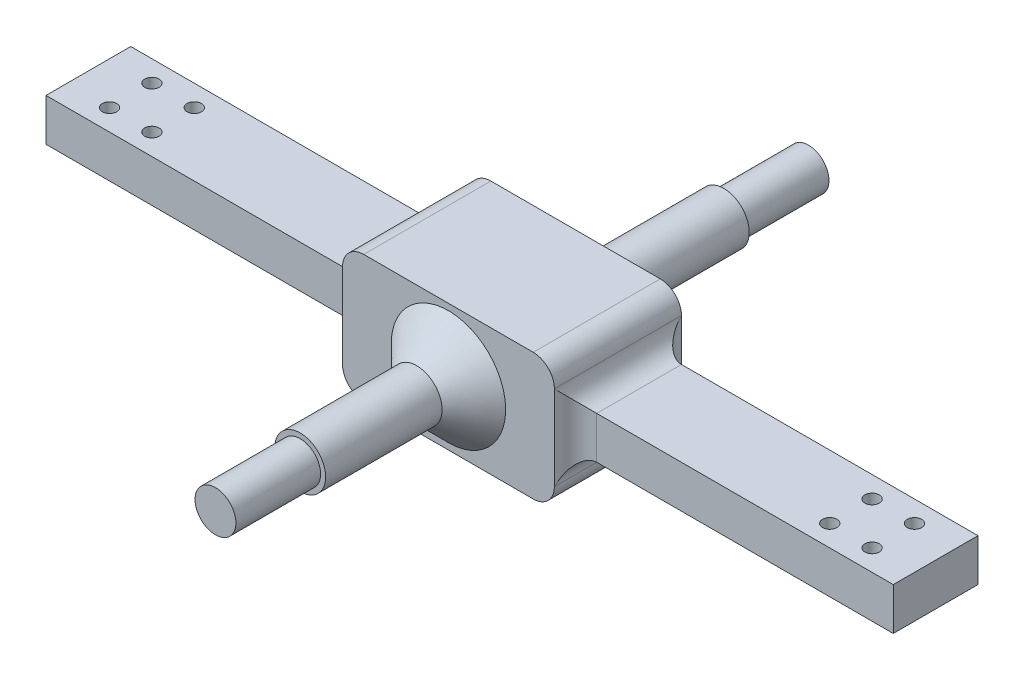
ISO-10303-21;
HEADER;
FILE_DESCRIPTION(('STEP AP214'),'2;1');
FILE_NAME('part.step','',(''),(''),'','','');
FILE_SCHEMA(('AUTOMOTIVE_DESIGN { 1 0 10303 214 1 1 1 1 }'));
ENDSEC;
DATA;
#1=APPLICATION_CONTEXT('core data for automotive mechanical design processes');
#2=APPLICATION_PROTOCOL_DEFINITION('international standard','automotive_design',2000,#1);
#3=PRODUCT_CONTEXT('',#1,'mechanical');
#4=PRODUCT('Part','Part','',(#3));
#5=PRODUCT_RELATED_PRODUCT_CATEGORY('part','',(#4));
#6=PRODUCT_DEFINITION_FORMATION('','',#4);
#7=PRODUCT_DEFINITION_CONTEXT('part definition',#1,'design');
#8=PRODUCT_DEFINITION('design','',#6,#7);
#9=PRODUCT_DEFINITION_SHAPE('','',#8);
#10=(LENGTH_UNIT() NAMED_UNIT(*) SI_UNIT(.MILLI.,.METRE.));
#11=(NAMED_UNIT(*) PLANE_ANGLE_UNIT() SI_UNIT($,.RADIAN.));
#12=(NAMED_UNIT(*) SI_UNIT($,.STERADIAN.) SOLID_ANGLE_UNIT());
#13=UNCERTAINTY_MEASURE_WITH_UNIT(LENGTH_MEASURE(1.E-05),#10,'distance_accuracy_value','');
#14=(GEOMETRIC_REPRESENTATION_CONTEXT(3) GLOBAL_UNCERTAINTY_ASSIGNED_CONTEXT((#13)) GLOBAL_UNIT_ASSIGNED_CONTEXT((#10,
#11,#12)) REPRESENTATION_CONTEXT('',''));
#15=CARTESIAN_POINT('',(0.,0.,0.));
#16=DIRECTION('',(0.,0.,1.));
#17=DIRECTION('',(1.,0.,0.));
#18=AXIS2_PLACEMENT_3D('',#15,#16,#17);
#19=CARTESIAN_POINT('',(-100.,5.,-10.));
#20=DIRECTION('',(0.,0.,1.));
#21=DIRECTION('',(1.,0.,0.));
#22=AXIS2_PLACEMENT_3D('',#19,#20,#21);
#23=PLANE('',#22);
#24=DIRECTION('',(-1.,0.,0.));
#25=VECTOR('',#24,1.);
#26=CARTESIAN_POINT('',(-100.,-5.,-10.));
#27=LINE('',#26,#25);
#28=CARTESIAN_POINT('',(100.,-5.,-10.));
#29=VERTEX_POINT('',#28);
#30=CARTESIAN_POINT('',(30.,-5.,-10.));
#31=VERTEX_POINT('',#30);
#32=EDGE_CURVE('E413',#29,#31,#27,.T.);
#33=ORIENTED_EDGE('',*,*,#32,.T.);
#34=DIRECTION('',(0.,-1.,0.));
#35=VECTOR('',#34,1.);
#36=CARTESIAN_POINT('',(30.,5.,-10.));
#37=LINE('',#36,#35);
#38=CARTESIAN_POINT('',(30.,5.,-10.));
#39=VERTEX_POINT('',#38);
#40=EDGE_CURVE('E172',#31,#39,#37,.F.);
#41=ORIENTED_EDGE('',*,*,#40,.T.);
#42=DIRECTION('',(-1.,0.,0.));
#43=VECTOR('',#42,1.);
#44=CARTESIAN_POINT('',(-100.,5.,-10.));
#45=LINE('',#44,#43);
#46=CARTESIAN_POINT('',(100.,5.,-10.));
#47=VERTEX_POINT('',#46);
#48=EDGE_CURVE('E165',#47,#39,#45,.T.);
#49=ORIENTED_EDGE('',*,*,#48,.F.);
#50=DIRECTION('',(0.,-1.,0.));
#51=VECTOR('',#50,1.);
#52=CARTESIAN_POINT('',(100.,5.,-10.));
#53=LINE('',#52,#51);
#54=EDGE_CURVE('E169',#47,#29,#53,.T.);
#55=ORIENTED_EDGE('',*,*,#54,.T.);
#56=EDGE_LOOP('',(#33,#41,#49,#55));
#57=FACE_BOUND('',#56,.T.);
#58=ADVANCED_FACE('F46',(#57),#23,.F.);
#59=CARTESIAN_POINT('',(-100.,5.,10.));
#60=DIRECTION('',(0.,0.,-1.));
#61=DIRECTION('',(-1.,0.,0.));
#62=AXIS2_PLACEMENT_3D('',#59,#60,#61);
#63=PLANE('',#62);
#64=DIRECTION('',(1.,0.,0.));
#65=VECTOR('',#64,1.);
#66=CARTESIAN_POINT('',(-100.,5.,10.));
#67=LINE('',#66,#65);
#68=CARTESIAN_POINT('',(30.,5.,10.));
#69=VERTEX_POINT('',#68);
#70=CARTESIAN_POINT('',(100.,5.,10.));
#71=VERTEX_POINT('',#70);
#72=EDGE_CURVE('E182',#69,#71,#67,.T.);
#73=ORIENTED_EDGE('',*,*,#72,.F.);
#74=DIRECTION('',(0.,1.,0.));
#75=VECTOR('',#74,1.);
#76=CARTESIAN_POINT('',(30.,-5.,10.));
#77=LINE('',#76,#75);
#78=CARTESIAN_POINT('',(30.,-5.,10.));
#79=VERTEX_POINT('',#78);
#80=EDGE_CURVE('E210',#69,#79,#77,.F.);
#81=ORIENTED_EDGE('',*,*,#80,.T.);
#82=DIRECTION('',(1.,0.,0.));
#83=VECTOR('',#82,1.);
#84=CARTESIAN_POINT('',(-100.,-5.,10.));
#85=LINE('',#84,#83);
#86=CARTESIAN_POINT('',(100.,-5.,10.));
#87=VERTEX_POINT('',#86);
#88=EDGE_CURVE('E419',#79,#87,#85,.T.);
#89=ORIENTED_EDGE('',*,*,#88,.T.);
#90=DIRECTION('',(0.,-1.,0.));
#91=VECTOR('',#90,1.);
#92=CARTESIAN_POINT('',(100.,5.,10.));
#93=LINE('',#92,#91);
#94=EDGE_CURVE('E409',#71,#87,#93,.T.);
#95=ORIENTED_EDGE('',*,*,#94,.F.);
#96=EDGE_LOOP('',(#73,#81,#89,#95));
#97=FACE_BOUND('',#96,.T.);
#98=ADVANCED_FACE('F494',(#97),#63,.F.);
#99=CARTESIAN_POINT('',(0.,5.,0.));
#100=DIRECTION('',(0.,-1.,0.));
#101=DIRECTION('',(0.,0.,-1.));
#102=AXIS2_PLACEMENT_3D('',#99,#100,#101);
#103=PLANE('',#102);
#104=CARTESIAN_POINT('',(90.,5.,5.));
#105=DIRECTION('',(0.,1.,0.));
#106=DIRECTION('',(0.,0.,1.));
#107=AXIS2_PLACEMENT_3D('',#104,#105,#106);
#108=CIRCLE('',#107,1.69999999999999);
#109=CARTESIAN_POINT('',(90.,5.,6.69999999999999));
#110=VERTEX_POINT('',#109);
#111=EDGE_CURVE('E349',#110,#110,#108,.T.);
#112=ORIENTED_EDGE('',*,*,#111,.F.);
#113=EDGE_LOOP('',(#112));
#114=FACE_BOUND('',#113,.T.);
#115=CARTESIAN_POINT('',(90.,5.,-5.));
#116=DIRECTION('',(0.,1.,0.));
#117=DIRECTION('',(0.,0.,1.));
#118=AXIS2_PLACEMENT_3D('',#115,#116,#117);
#119=CIRCLE('',#118,1.69999999999999);
#120=CARTESIAN_POINT('',(90.,5.,-3.30000000000001));
#121=VERTEX_POINT('',#120);
#122=EDGE_CURVE('E335',#121,#121,#119,.T.);
#123=ORIENTED_EDGE('',*,*,#122,.F.);
#124=EDGE_LOOP('',(#123));
#125=FACE_BOUND('',#124,.T.);
#126=CARTESIAN_POINT('',(80.,5.,-5.));
#127=DIRECTION('',(0.,1.,0.));
#128=DIRECTION('',(0.,0.,1.));
#129=AXIS2_PLACEMENT_3D('',#126,#127,#128);
#130=CIRCLE('',#129,1.69999999999999);
#131=CARTESIAN_POINT('',(80.,5.,-3.30000000000001));
#132=VERTEX_POINT('',#131);
#133=EDGE_CURVE('E330',#132,#132,#130,.T.);
#134=ORIENTED_EDGE('',*,*,#133,.F.);
#135=EDGE_LOOP('',(#134));
#136=FACE_BOUND('',#135,.T.);
#137=CARTESIAN_POINT('',(80.,5.,5.));
#138=DIRECTION('',(0.,1.,0.));
#139=DIRECTION('',(0.,0.,1.));
#140=AXIS2_PLACEMENT_3D('',#137,#138,#139);
#141=CIRCLE('',#140,1.69999999999999);
#142=CARTESIAN_POINT('',(80.,5.,6.69999999999999));
#143=VERTEX_POINT('',#142);
#144=EDGE_CURVE('E326',#143,#143,#141,.T.);
#145=ORIENTED_EDGE('',*,*,#144,.F.);
#146=EDGE_LOOP('',(#145));
#147=FACE_BOUND('',#146,.T.);
#148=ORIENTED_EDGE('',*,*,#48,.T.);
#149=DIRECTION('',(0.,0.,-1.));
#150=VECTOR('',#149,1.);
#151=CARTESIAN_POINT('',(30.,5.,10.));
#152=LINE('',#151,#150);
#153=EDGE_CURVE('E216',#39,#69,#152,.F.);
#154=ORIENTED_EDGE('',*,*,#153,.T.);
#155=ORIENTED_EDGE('',*,*,#72,.T.);
#156=DIRECTION('',(0.,0.,-1.));
#157=VECTOR('',#156,1.);
#158=CARTESIAN_POINT('',(100.,5.,10.));
#159=LINE('',#158,#157);
#160=EDGE_CURVE('E179',#71,#47,#159,.T.);
#161=ORIENTED_EDGE('',*,*,#160,.T.);
#162=EDGE_LOOP('',(#148,#154,#155,#161));
#163=FACE_BOUND('',#162,.T.);
#164=ADVANCED_FACE('F180',(#114,#125,#136,#147,#163),#103,.F.);
#165=CARTESIAN_POINT('',(0.,-5.,0.));
#166=DIRECTION('',(0.,-1.,0.));
#167=DIRECTION('',(0.,0.,-1.));
#168=AXIS2_PLACEMENT_3D('',#165,#166,#167);
#169=PLANE('',#168);
#170=CARTESIAN_POINT('',(90.,-5.,5.));
#171=DIRECTION('',(0.,-1.,0.));
#172=DIRECTION('',(0.,0.,-1.));
#173=AXIS2_PLACEMENT_3D('',#170,#171,#172);
#174=CIRCLE('',#173,1.69999999999999);
#175=CARTESIAN_POINT('',(90.,-5.,3.30000000000001));
#176=VERTEX_POINT('',#175);
#177=EDGE_CURVE('E51',#176,#176,#174,.T.);
#178=ORIENTED_EDGE('',*,*,#177,.F.);
#179=EDGE_LOOP('',(#178));
#180=FACE_BOUND('',#179,.T.);
#181=CARTESIAN_POINT('',(90.,-5.,-5.));
#182=DIRECTION('',(0.,-1.,0.));
#183=DIRECTION('',(0.,0.,-1.));
#184=AXIS2_PLACEMENT_3D('',#181,#182,#183);
#185=CIRCLE('',#184,1.69999999999999);
#186=CARTESIAN_POINT('',(90.,-5.,-6.69999999999999));
#187=VERTEX_POINT('',#186);
#188=EDGE_CURVE('E331',#187,#187,#185,.T.);
#189=ORIENTED_EDGE('',*,*,#188,.F.);
#190=EDGE_LOOP('',(#189));
#191=FACE_BOUND('',#190,.T.);
#192=CARTESIAN_POINT('',(80.,-5.,-5.));
#193=DIRECTION('',(0.,-1.,0.));
#194=DIRECTION('',(0.,0.,-1.));
#195=AXIS2_PLACEMENT_3D('',#192,#193,#194);
#196=CIRCLE('',#195,1.69999999999999);
#197=CARTESIAN_POINT('',(80.,-5.,-6.69999999999999));
#198=VERTEX_POINT('',#197);
#199=EDGE_CURVE('E327',#198,#198,#196,.T.);
#200=ORIENTED_EDGE('',*,*,#199,.F.);
#201=EDGE_LOOP('',(#200));
#202=FACE_BOUND('',#201,.T.);
#203=CARTESIAN_POINT('',(80.,-5.,5.));
#204=DIRECTION('',(0.,-1.,0.));
#205=DIRECTION('',(0.,0.,-1.));
#206=AXIS2_PLACEMENT_3D('',#203,#204,#205);
#207=CIRCLE('',#206,1.69999999999999);
#208=CARTESIAN_POINT('',(80.,-5.,3.30000000000001));
#209=VERTEX_POINT('',#208);
#210=EDGE_CURVE('E321',#209,#209,#207,.T.);
#211=ORIENTED_EDGE('',*,*,#210,.F.);
#212=EDGE_LOOP('',(#211));
#213=FACE_BOUND('',#212,.T.);
#214=ORIENTED_EDGE('',*,*,#88,.F.);
#215=DIRECTION('',(0.,0.,-1.));
#216=VECTOR('',#215,1.);
#217=CARTESIAN_POINT('',(30.,-5.,0.));
#218=LINE('',#217,#216);
#219=EDGE_CURVE('E213',#79,#31,#218,.T.);
#220=ORIENTED_EDGE('',*,*,#219,.T.);
#221=ORIENTED_EDGE('',*,*,#32,.F.);
#222=DIRECTION('',(0.,0.,-1.));
#223=VECTOR('',#222,1.);
#224=CARTESIAN_POINT('',(100.,-5.,10.));
#225=LINE('',#224,#223);
#226=EDGE_CURVE('E191',#87,#29,#225,.T.);
#227=ORIENTED_EDGE('',*,*,#226,.F.);
#228=EDGE_LOOP('',(#214,#220,#221,#227));
#229=FACE_BOUND('',#228,.T.);
#230=ADVANCED_FACE('F487',(#180,#191,#202,#213,#229),#169,.T.);
#231=CARTESIAN_POINT('',(100.,5.,10.));
#232=DIRECTION('',(-1.,0.,0.));
#233=DIRECTION('',(0.,0.,1.));
#234=AXIS2_PLACEMENT_3D('',#231,#232,#233);
#235=PLANE('',#234);
#236=ORIENTED_EDGE('',*,*,#226,.T.);
#237=ORIENTED_EDGE('',*,*,#54,.F.);
#238=ORIENTED_EDGE('',*,*,#160,.F.);
#239=ORIENTED_EDGE('',*,*,#94,.T.);
#240=EDGE_LOOP('',(#236,#237,#238,#239));
#241=FACE_BOUND('',#240,.T.);
#242=ADVANCED_FACE('F189',(#241),#235,.F.);
#243=CARTESIAN_POINT('',(-25.,15.,15.));
#244=DIRECTION('',(0.,-1.,0.));
#245=DIRECTION('',(0.,0.,-1.));
#246=AXIS2_PLACEMENT_3D('',#243,#244,#245);
#247=PLANE('',#246);
#248=DIRECTION('',(-1.,0.,0.));
#249=VECTOR('',#248,1.);
#250=CARTESIAN_POINT('',(-25.,15.,15.));
#251=LINE('',#250,#249);
#252=CARTESIAN_POINT('',(20.,15.,15.));
#253=VERTEX_POINT('',#252);
#254=CARTESIAN_POINT('',(-20.,15.,15.));
#255=VERTEX_POINT('',#254);
#256=EDGE_CURVE('E379',#253,#255,#251,.T.);
#257=ORIENTED_EDGE('',*,*,#256,.F.);
#258=DIRECTION('',(0.,0.,-1.));
#259=VECTOR('',#258,1.);
#260=CARTESIAN_POINT('',(20.,15.,15.));
#261=LINE('',#260,#259);
#262=CARTESIAN_POINT('',(20.,15.,-15.));
#263=VERTEX_POINT('',#262);
#264=EDGE_CURVE('E256',#253,#263,#261,.T.);
#265=ORIENTED_EDGE('',*,*,#264,.T.);
#266=DIRECTION('',(-1.,0.,0.));
#267=VECTOR('',#266,1.);
#268=CARTESIAN_POINT('',(-25.,15.,-15.));
#269=LINE('',#268,#267);
#270=CARTESIAN_POINT('',(-20.,15.,-15.));
#271=VERTEX_POINT('',#270);
#272=EDGE_CURVE('E393',#263,#271,#269,.T.);
#273=ORIENTED_EDGE('',*,*,#272,.T.);
#274=DIRECTION('',(0.,0.,-1.));
#275=VECTOR('',#274,1.);
#276=CARTESIAN_POINT('',(-20.,15.,15.));
#277=LINE('',#276,#275);
#278=EDGE_CURVE('E65',#271,#255,#277,.F.);
#279=ORIENTED_EDGE('',*,*,#278,.T.);
#280=EDGE_LOOP('',(#257,#265,#273,#279));
#281=FACE_BOUND('',#280,.T.);
#282=ADVANCED_FACE('F516',(#281),#247,.F.);
#283=CARTESIAN_POINT('',(-25.,-15.,15.));
#284=DIRECTION('',(0.,1.,0.));
#285=DIRECTION('',(0.,0.,1.));
#286=AXIS2_PLACEMENT_3D('',#283,#284,#285);
#287=PLANE('',#286);
#288=DIRECTION('',(1.,0.,0.));
#289=VECTOR('',#288,1.);
#290=CARTESIAN_POINT('',(-25.,-15.,-15.));
#291=LINE('',#290,#289);
#292=CARTESIAN_POINT('',(-20.,-15.,-15.));
#293=VERTEX_POINT('',#292);
#294=CARTESIAN_POINT('',(20.,-15.,-15.));
#295=VERTEX_POINT('',#294);
#296=EDGE_CURVE('E380',#293,#295,#291,.T.);
#297=ORIENTED_EDGE('',*,*,#296,.T.);
#298=DIRECTION('',(0.,0.,-1.));
#299=VECTOR('',#298,1.);
#300=CARTESIAN_POINT('',(20.,-15.,15.));
#301=LINE('',#300,#299);
#302=CARTESIAN_POINT('',(20.,-15.,15.));
#303=VERTEX_POINT('',#302);
#304=EDGE_CURVE('E240',#295,#303,#301,.F.);
#305=ORIENTED_EDGE('',*,*,#304,.T.);
#306=DIRECTION('',(1.,0.,0.));
#307=VECTOR('',#306,1.);
#308=CARTESIAN_POINT('',(-25.,-15.,15.));
#309=LINE('',#308,#307);
#310=CARTESIAN_POINT('',(-20.,-15.,15.));
#311=VERTEX_POINT('',#310);
#312=EDGE_CURVE('E386',#311,#303,#309,.T.);
#313=ORIENTED_EDGE('',*,*,#312,.F.);
#314=DIRECTION('',(0.,0.,-1.));
#315=VECTOR('',#314,1.);
#316=CARTESIAN_POINT('',(-20.,-15.,15.));
#317=LINE('',#316,#315);
#318=EDGE_CURVE('E237',#311,#293,#317,.T.);
#319=ORIENTED_EDGE('',*,*,#318,.T.);
#320=EDGE_LOOP('',(#297,#305,#313,#319));
#321=FACE_BOUND('',#320,.T.);
#322=ADVANCED_FACE('F519',(#321),#287,.F.);
#323=CARTESIAN_POINT('',(0.,0.,15.));
#324=DIRECTION('',(0.,0.,-1.));
#325=DIRECTION('',(-1.,0.,0.));
#326=AXIS2_PLACEMENT_3D('',#323,#324,#325);
#327=PLANE('',#326);
#328=CARTESIAN_POINT('',(0.,0.,15.));
#329=DIRECTION('',(0.,0.,-1.));
#330=DIRECTION('',(-1.,0.,0.));
#331=AXIS2_PLACEMENT_3D('',#328,#329,#330);
#332=CIRCLE('',#331,13.5);
#333=CARTESIAN_POINT('',(-13.5,0.,15.));
#334=VERTEX_POINT('',#333);
#335=EDGE_CURVE('E309',#334,#334,#332,.T.);
#336=ORIENTED_EDGE('',*,*,#335,.T.);
#337=EDGE_LOOP('',(#336));
#338=FACE_BOUND('',#337,.T.);
#339=ORIENTED_EDGE('',*,*,#312,.T.);
#340=CARTESIAN_POINT('',(20.,-10.,15.));
#341=DIRECTION('',(0.,0.,-1.));
#342=DIRECTION('',(-1.,0.,0.));
#343=AXIS2_PLACEMENT_3D('',#340,#341,#342);
#344=CIRCLE('',#343,5.);
#345=CARTESIAN_POINT('',(25.,-10.,15.));
#346=VERTEX_POINT('',#345);
#347=EDGE_CURVE('E251',#303,#346,#344,.F.);
#348=ORIENTED_EDGE('',*,*,#347,.T.);
#349=DIRECTION('',(0.,1.,0.));
#350=VECTOR('',#349,1.);
#351=CARTESIAN_POINT('',(25.,-15.,15.));
#352=LINE('',#351,#350);
#353=CARTESIAN_POINT('',(25.,10.,15.));
#354=VERTEX_POINT('',#353);
#355=EDGE_CURVE('E376',#346,#354,#352,.T.);
#356=ORIENTED_EDGE('',*,*,#355,.T.);
#357=CARTESIAN_POINT('',(20.,10.,15.));
#358=DIRECTION('',(0.,0.,-1.));
#359=DIRECTION('',(-1.,0.,0.));
#360=AXIS2_PLACEMENT_3D('',#357,#358,#359);
#361=CIRCLE('',#360,5.);
#362=EDGE_CURVE('E72',#354,#253,#361,.F.);
#363=ORIENTED_EDGE('',*,*,#362,.T.);
#364=ORIENTED_EDGE('',*,*,#256,.T.);
#365=CARTESIAN_POINT('',(-20.,10.,15.));
#366=DIRECTION('',(0.,0.,-1.));
#367=DIRECTION('',(-1.,0.,0.));
#368=AXIS2_PLACEMENT_3D('',#365,#366,#367);
#369=CIRCLE('',#368,5.);
#370=CARTESIAN_POINT('',(-25.,10.,15.));
#371=VERTEX_POINT('',#370);
#372=EDGE_CURVE('E243',#255,#371,#369,.F.);
#373=ORIENTED_EDGE('',*,*,#372,.T.);
#374=DIRECTION('',(0.,-1.,0.));
#375=VECTOR('',#374,1.);
#376=CARTESIAN_POINT('',(-25.,-15.,15.));
#377=LINE('',#376,#375);
#378=CARTESIAN_POINT('',(-25.,-10.,15.));
#379=VERTEX_POINT('',#378);
#380=EDGE_CURVE('E383',#371,#379,#377,.T.);
#381=ORIENTED_EDGE('',*,*,#380,.T.);
#382=CARTESIAN_POINT('',(-20.,-10.,15.));
#383=DIRECTION('',(0.,0.,-1.));
#384=DIRECTION('',(-1.,0.,0.));
#385=AXIS2_PLACEMENT_3D('',#382,#383,#384);
#386=CIRCLE('',#385,5.);
#387=EDGE_CURVE('E248',#379,#311,#386,.F.);
#388=ORIENTED_EDGE('',*,*,#387,.T.);
#389=EDGE_LOOP('',(#339,#348,#356,#363,#364,#373,#381,#388));
#390=FACE_BOUND('',#389,.T.);
#391=ADVANCED_FACE('F488',(#338,#390),#327,.F.);
#392=CARTESIAN_POINT('',(0.,0.,-15.));
#393=DIRECTION('',(0.,0.,-1.));
#394=DIRECTION('',(-1.,0.,0.));
#395=AXIS2_PLACEMENT_3D('',#392,#393,#394);
#396=PLANE('',#395);
#397=CARTESIAN_POINT('',(0.,0.,-15.));
#398=DIRECTION('',(0.,0.,-1.));
#399=DIRECTION('',(-1.,0.,0.));
#400=AXIS2_PLACEMENT_3D('',#397,#398,#399);
#401=CIRCLE('',#400,13.5);
#402=CARTESIAN_POINT('',(-13.5,0.,-15.));
#403=VERTEX_POINT('',#402);
#404=EDGE_CURVE('E313',#403,#403,#401,.F.);
#405=ORIENTED_EDGE('',*,*,#404,.T.);
#406=EDGE_LOOP('',(#405));
#407=FACE_BOUND('',#406,.T.);
#408=DIRECTION('',(0.,1.,0.));
#409=VECTOR('',#408,1.);
#410=CARTESIAN_POINT('',(25.,-15.,-15.));
#411=LINE('',#410,#409);
#412=CARTESIAN_POINT('',(25.,-10.,-15.));
#413=VERTEX_POINT('',#412);
#414=CARTESIAN_POINT('',(25.,10.,-15.));
#415=VERTEX_POINT('',#414);
#416=EDGE_CURVE('E283',#413,#415,#411,.T.);
#417=ORIENTED_EDGE('',*,*,#416,.F.);
#418=CARTESIAN_POINT('',(20.,-10.,-15.));
#419=DIRECTION('',(0.,0.,-1.));
#420=DIRECTION('',(-1.,0.,0.));
#421=AXIS2_PLACEMENT_3D('',#418,#419,#420);
#422=CIRCLE('',#421,5.);
#423=EDGE_CURVE('E234',#413,#295,#422,.T.);
#424=ORIENTED_EDGE('',*,*,#423,.T.);
#425=ORIENTED_EDGE('',*,*,#296,.F.);
#426=CARTESIAN_POINT('',(-20.,-10.,-15.));
#427=DIRECTION('',(0.,0.,-1.));
#428=DIRECTION('',(-1.,0.,0.));
#429=AXIS2_PLACEMENT_3D('',#426,#427,#428);
#430=CIRCLE('',#429,5.);
#431=CARTESIAN_POINT('',(-25.,-10.,-15.));
#432=VERTEX_POINT('',#431);
#433=EDGE_CURVE('E231',#293,#432,#430,.T.);
#434=ORIENTED_EDGE('',*,*,#433,.T.);
#435=DIRECTION('',(0.,-1.,0.));
#436=VECTOR('',#435,1.);
#437=CARTESIAN_POINT('',(-25.,-15.,-15.));
#438=LINE('',#437,#436);
#439=CARTESIAN_POINT('',(-25.,10.,-15.));
#440=VERTEX_POINT('',#439);
#441=EDGE_CURVE('E396',#440,#432,#438,.T.);
#442=ORIENTED_EDGE('',*,*,#441,.F.);
#443=CARTESIAN_POINT('',(-20.,10.,-15.));
#444=DIRECTION('',(0.,0.,-1.));
#445=DIRECTION('',(-1.,0.,0.));
#446=AXIS2_PLACEMENT_3D('',#443,#444,#445);
#447=CIRCLE('',#446,5.);
#448=EDGE_CURVE('E225',#440,#271,#447,.T.);
#449=ORIENTED_EDGE('',*,*,#448,.T.);
#450=ORIENTED_EDGE('',*,*,#272,.F.);
#451=CARTESIAN_POINT('',(20.,10.,-15.));
#452=DIRECTION('',(0.,0.,-1.));
#453=DIRECTION('',(-1.,0.,0.));
#454=AXIS2_PLACEMENT_3D('',#451,#452,#453);
#455=CIRCLE('',#454,5.);
#456=EDGE_CURVE('E228',#263,#415,#455,.T.);
#457=ORIENTED_EDGE('',*,*,#456,.T.);
#458=EDGE_LOOP('',(#417,#424,#425,#434,#442,#449,#450,#457));
#459=FACE_BOUND('',#458,.T.);
#460=ADVANCED_FACE('F464',(#407,#459),#396,.T.);
#461=CARTESIAN_POINT('',(-100.,5.,10.));
#462=DIRECTION('',(1.,0.,0.));
#463=DIRECTION('',(0.,0.,-1.));
#464=AXIS2_PLACEMENT_3D('',#461,#462,#463);
#465=PLANE('',#464);
#466=DIRECTION('',(0.,0.,1.));
#467=VECTOR('',#466,1.);
#468=CARTESIAN_POINT('',(-100.,-5.,10.));
#469=LINE('',#468,#467);
#470=CARTESIAN_POINT('',(-100.,-5.,-10.));
#471=VERTEX_POINT('',#470);
#472=CARTESIAN_POINT('',(-100.,-5.,10.));
#473=VERTEX_POINT('',#472);
#474=EDGE_CURVE('E416',#471,#473,#469,.T.);
#475=ORIENTED_EDGE('',*,*,#474,.T.);
#476=DIRECTION('',(0.,-1.,0.));
#477=VECTOR('',#476,1.);
#478=CARTESIAN_POINT('',(-100.,5.,10.));
#479=LINE('',#478,#477);
#480=CARTESIAN_POINT('',(-100.,5.,10.));
#481=VERTEX_POINT('',#480);
#482=EDGE_CURVE('E202',#481,#473,#479,.T.);
#483=ORIENTED_EDGE('',*,*,#482,.F.);
#484=DIRECTION('',(0.,0.,1.));
#485=VECTOR('',#484,1.);
#486=CARTESIAN_POINT('',(-100.,5.,10.));
#487=LINE('',#486,#485);
#488=CARTESIAN_POINT('',(-100.,5.,-10.));
#489=VERTEX_POINT('',#488);
#490=EDGE_CURVE('E175',#489,#481,#487,.T.);
#491=ORIENTED_EDGE('',*,*,#490,.F.);
#492=DIRECTION('',(0.,-1.,0.));
#493=VECTOR('',#492,1.);
#494=CARTESIAN_POINT('',(-100.,5.,-10.));
#495=LINE('',#494,#493);
#496=EDGE_CURVE('E194',#489,#471,#495,.T.);
#497=ORIENTED_EDGE('',*,*,#496,.T.);
#498=EDGE_LOOP('',(#475,#483,#491,#497));
#499=FACE_BOUND('',#498,.T.);
#500=ADVANCED_FACE('F478',(#499),#465,.F.);
#501=CARTESIAN_POINT('',(-90.,-5.,-5.));
#502=DIRECTION('',(0.,-1.,0.));
#503=DIRECTION('',(0.,0.,-1.));
#504=AXIS2_PLACEMENT_3D('',#501,#502,#503);
#505=CIRCLE('',#504,1.69999999999999);
#506=CARTESIAN_POINT('',(-90.,-5.,-6.69999999999999));
#507=VERTEX_POINT('',#506);
#508=EDGE_CURVE('E606',#507,#507,#505,.T.);
#509=ORIENTED_EDGE('',*,*,#508,.F.);
#510=EDGE_LOOP('',(#509));
#511=FACE_BOUND('',#510,.T.);
#512=CARTESIAN_POINT('',(-90.,-5.,5.));
#513=DIRECTION('',(0.,-1.,0.));
#514=DIRECTION('',(0.,0.,-1.));
#515=AXIS2_PLACEMENT_3D('',#512,#513,#514);
#516=CIRCLE('',#515,1.69999999999999);
#517=CARTESIAN_POINT('',(-90.,-5.,3.30000000000001));
#518=VERTEX_POINT('',#517);
#519=EDGE_CURVE('E613',#518,#518,#516,.T.);
#520=ORIENTED_EDGE('',*,*,#519,.F.);
#521=EDGE_LOOP('',(#520));
#522=FACE_BOUND('',#521,.T.);
#523=CARTESIAN_POINT('',(-80.,-5.,-5.));
#524=DIRECTION('',(0.,-1.,0.));
#525=DIRECTION('',(0.,0.,-1.));
#526=AXIS2_PLACEMENT_3D('',#523,#524,#525);
#527=CIRCLE('',#526,1.69999999999999);
#528=CARTESIAN_POINT('',(-80.,-5.,-6.69999999999999));
#529=VERTEX_POINT('',#528);
#530=EDGE_CURVE('E341',#529,#529,#527,.T.);
#531=ORIENTED_EDGE('',*,*,#530,.F.);
#532=EDGE_LOOP('',(#531));
#533=FACE_BOUND('',#532,.T.);
#534=CARTESIAN_POINT('',(-80.,-5.,5.));
#535=DIRECTION('',(0.,-1.,0.));
#536=DIRECTION('',(0.,0.,-1.));
#537=AXIS2_PLACEMENT_3D('',#534,#535,#536);
#538=CIRCLE('',#537,1.69999999999999);
#539=CARTESIAN_POINT('',(-80.,-5.,3.30000000000001));
#540=VERTEX_POINT('',#539);
#541=EDGE_CURVE('E360',#540,#540,#538,.T.);
#542=ORIENTED_EDGE('',*,*,#541,.F.);
#543=EDGE_LOOP('',(#542));
#544=FACE_BOUND('',#543,.T.);
#545=CARTESIAN_POINT('',(-30.,-5.,-10.));
#546=VERTEX_POINT('',#545);
#547=EDGE_CURVE('E412',#546,#471,#27,.T.);
#548=ORIENTED_EDGE('',*,*,#547,.F.);
#549=DIRECTION('',(0.,0.,1.));
#550=VECTOR('',#549,1.);
#551=CARTESIAN_POINT('',(-30.,-5.,0.));
#552=LINE('',#551,#550);
#553=CARTESIAN_POINT('',(-30.,-5.,10.));
#554=VERTEX_POINT('',#553);
#555=EDGE_CURVE('E219',#546,#554,#552,.T.);
#556=ORIENTED_EDGE('',*,*,#555,.T.);
#557=EDGE_CURVE('E187',#473,#554,#85,.T.);
#558=ORIENTED_EDGE('',*,*,#557,.F.);
#559=ORIENTED_EDGE('',*,*,#474,.F.);
#560=EDGE_LOOP('',(#548,#556,#558,#559));
#561=FACE_BOUND('',#560,.T.);
#562=ADVANCED_FACE('F437',(#511,#522,#533,#544,#561),#169,.T.);
#563=CARTESIAN_POINT('',(-90.,5.,-5.));
#564=DIRECTION('',(0.,1.,0.));
#565=DIRECTION('',(0.,0.,1.));
#566=AXIS2_PLACEMENT_3D('',#563,#564,#565);
#567=CIRCLE('',#566,1.69999999999999);
#568=CARTESIAN_POINT('',(-90.,5.,-3.30000000000001));
#569=VERTEX_POINT('',#568);
#570=EDGE_CURVE('E597',#569,#569,#567,.T.);
#571=ORIENTED_EDGE('',*,*,#570,.F.);
#572=EDGE_LOOP('',(#571));
#573=FACE_BOUND('',#572,.T.);
#574=CARTESIAN_POINT('',(-90.,5.,5.));
#575=DIRECTION('',(0.,1.,0.));
#576=DIRECTION('',(0.,0.,1.));
#577=AXIS2_PLACEMENT_3D('',#574,#575,#576);
#578=CIRCLE('',#577,1.69999999999999);
#579=CARTESIAN_POINT('',(-90.,5.,6.69999999999999));
#580=VERTEX_POINT('',#579);
#581=EDGE_CURVE('E610',#580,#580,#578,.T.);
#582=ORIENTED_EDGE('',*,*,#581,.F.);
#583=EDGE_LOOP('',(#582));
#584=FACE_BOUND('',#583,.T.);
#585=CARTESIAN_POINT('',(-80.,5.,-5.));
#586=DIRECTION('',(0.,1.,0.));
#587=DIRECTION('',(0.,0.,1.));
#588=AXIS2_PLACEMENT_3D('',#585,#586,#587);
#589=CIRCLE('',#588,1.69999999999999);
#590=CARTESIAN_POINT('',(-80.,5.,-3.30000000000001));
#591=VERTEX_POINT('',#590);
#592=EDGE_CURVE('E334',#591,#591,#589,.T.);
#593=ORIENTED_EDGE('',*,*,#592,.F.);
#594=EDGE_LOOP('',(#593));
#595=FACE_BOUND('',#594,.T.);
#596=CARTESIAN_POINT('',(-80.,5.,5.));
#597=DIRECTION('',(0.,1.,0.));
#598=DIRECTION('',(0.,0.,1.));
#599=AXIS2_PLACEMENT_3D('',#596,#597,#598);
#600=CIRCLE('',#599,1.69999999999999);
#601=CARTESIAN_POINT('',(-80.,5.,6.69999999999999));
#602=VERTEX_POINT('',#601);
#603=EDGE_CURVE('E356',#602,#602,#600,.T.);
#604=ORIENTED_EDGE('',*,*,#603,.F.);
#605=EDGE_LOOP('',(#604));
#606=FACE_BOUND('',#605,.T.);
#607=CARTESIAN_POINT('',(-30.,5.,10.));
#608=VERTEX_POINT('',#607);
#609=EDGE_CURVE('E405',#481,#608,#67,.T.);
#610=ORIENTED_EDGE('',*,*,#609,.T.);
#611=DIRECTION('',(0.,0.,1.));
#612=VECTOR('',#611,1.);
#613=CARTESIAN_POINT('',(-30.,5.,-10.));
#614=LINE('',#613,#612);
#615=CARTESIAN_POINT('',(-30.,5.,-10.));
#616=VERTEX_POINT('',#615);
#617=EDGE_CURVE('E222',#608,#616,#614,.F.);
#618=ORIENTED_EDGE('',*,*,#617,.T.);
#619=EDGE_CURVE('E176',#616,#489,#45,.T.);
#620=ORIENTED_EDGE('',*,*,#619,.T.);
#621=ORIENTED_EDGE('',*,*,#490,.T.);
#622=EDGE_LOOP('',(#610,#618,#620,#621));
#623=FACE_BOUND('',#622,.T.);
#624=ADVANCED_FACE('F477',(#573,#584,#595,#606,#623),#103,.F.);
#625=ORIENTED_EDGE('',*,*,#557,.T.);
#626=DIRECTION('',(0.,-1.,0.));
#627=VECTOR('',#626,1.);
#628=CARTESIAN_POINT('',(-30.,5.,10.));
#629=LINE('',#628,#627);
#630=EDGE_CURVE('E199',#554,#608,#629,.F.);
#631=ORIENTED_EDGE('',*,*,#630,.T.);
#632=ORIENTED_EDGE('',*,*,#609,.F.);
#633=ORIENTED_EDGE('',*,*,#482,.T.);
#634=EDGE_LOOP('',(#625,#631,#632,#633));
#635=FACE_BOUND('',#634,.T.);
#636=ADVANCED_FACE('F430',(#635),#63,.F.);
#637=ORIENTED_EDGE('',*,*,#619,.F.);
#638=DIRECTION('',(0.,1.,0.));
#639=VECTOR('',#638,1.);
#640=CARTESIAN_POINT('',(-30.,-5.,-10.));
#641=LINE('',#640,#639);
#642=EDGE_CURVE('E193',#616,#546,#641,.F.);
#643=ORIENTED_EDGE('',*,*,#642,.T.);
#644=ORIENTED_EDGE('',*,*,#547,.T.);
#645=ORIENTED_EDGE('',*,*,#496,.F.);
#646=EDGE_LOOP('',(#637,#643,#644,#645));
#647=FACE_BOUND('',#646,.T.);
#648=ADVANCED_FACE('F446',(#647),#23,.F.);
#649=CARTESIAN_POINT('',(-20.,-10.,15.));
#650=DIRECTION('',(0.,0.,-1.));
#651=DIRECTION('',(-1.,0.,0.));
#652=AXIS2_PLACEMENT_3D('',#649,#650,#651);
#653=CYLINDRICAL_SURFACE('',#652,5.);
#654=ORIENTED_EDGE('',*,*,#318,.F.);
#655=ORIENTED_EDGE('',*,*,#387,.F.);
#656=DIRECTION('',(0.,0.,-1.));
#657=VECTOR('',#656,1.);
#658=CARTESIAN_POINT('',(-25.,-10.,15.));
#659=LINE('',#658,#657);
#660=EDGE_CURVE('E275',#432,#379,#659,.F.);
#661=ORIENTED_EDGE('',*,*,#660,.F.);
#662=ORIENTED_EDGE('',*,*,#433,.F.);
#663=EDGE_LOOP('',(#654,#655,#661,#662));
#664=FACE_BOUND('',#663,.T.);
#665=ADVANCED_FACE('F471',(#664),#653,.T.);
#666=CARTESIAN_POINT('',(-20.,10.,15.));
#667=DIRECTION('',(0.,0.,-1.));
#668=DIRECTION('',(-1.,0.,0.));
#669=AXIS2_PLACEMENT_3D('',#666,#667,#668);
#670=CYLINDRICAL_SURFACE('',#669,5.);
#671=ORIENTED_EDGE('',*,*,#278,.F.);
#672=ORIENTED_EDGE('',*,*,#448,.F.);
#673=DIRECTION('',(0.,0.,-1.));
#674=VECTOR('',#673,1.);
#675=CARTESIAN_POINT('',(-25.,10.,15.));
#676=LINE('',#675,#674);
#677=EDGE_CURVE('E271',#371,#440,#676,.T.);
#678=ORIENTED_EDGE('',*,*,#677,.F.);
#679=ORIENTED_EDGE('',*,*,#372,.F.);
#680=EDGE_LOOP('',(#671,#672,#678,#679));
#681=FACE_BOUND('',#680,.T.);
#682=ADVANCED_FACE('F460',(#681),#670,.T.);
#683=CARTESIAN_POINT('',(-30.,-15.,15.));
#684=DIRECTION('',(0.,1.,0.));
#685=DIRECTION('',(0.,0.,1.));
#686=AXIS2_PLACEMENT_3D('',#683,#684,#685);
#687=CYLINDRICAL_SURFACE('',#686,5.);
#688=CARTESIAN_POINT('',(-30.,10.,15.));
#689=DIRECTION('',(0.,0.707106781186547,-0.707106781186547));
#690=DIRECTION('',(0.,-0.707106781186547,-0.707106781186547));
#691=AXIS2_PLACEMENT_3D('',#688,#689,#690);
#692=ELLIPSE('',#691,7.07106781186547,5.);
#693=EDGE_CURVE('E267',#608,#371,#692,.F.);
#694=ORIENTED_EDGE('',*,*,#693,.F.);
#695=ORIENTED_EDGE('',*,*,#630,.F.);
#696=CARTESIAN_POINT('',(-30.,-10.,15.));
#697=DIRECTION('',(0.,0.707106781186547,0.707106781186547));
#698=DIRECTION('',(0.,-0.707106781186547,0.707106781186547));
#699=AXIS2_PLACEMENT_3D('',#696,#697,#698);
#700=ELLIPSE('',#699,7.07106781186547,5.);
#701=EDGE_CURVE('E279',#379,#554,#700,.T.);
#702=ORIENTED_EDGE('',*,*,#701,.F.);
#703=ORIENTED_EDGE('',*,*,#380,.F.);
#704=EDGE_LOOP('',(#694,#695,#702,#703));
#705=FACE_BOUND('',#704,.T.);
#706=ADVANCED_FACE('F475',(#705),#687,.F.);
#707=CARTESIAN_POINT('',(-30.,-10.,0.));
#708=DIRECTION('',(0.,0.,1.));
#709=DIRECTION('',(1.,0.,0.));
#710=AXIS2_PLACEMENT_3D('',#707,#708,#709);
#711=CYLINDRICAL_SURFACE('',#710,5.);
#712=ORIENTED_EDGE('',*,*,#701,.T.);
#713=ORIENTED_EDGE('',*,*,#555,.F.);
#714=CARTESIAN_POINT('',(-30.,-10.,-15.));
#715=DIRECTION('',(0.,-0.707106781186547,0.707106781186547));
#716=DIRECTION('',(0.,0.707106781186547,0.707106781186547));
#717=AXIS2_PLACEMENT_3D('',#714,#715,#716);
#718=ELLIPSE('',#717,7.07106781186547,5.);
#719=EDGE_CURVE('E263',#432,#546,#718,.T.);
#720=ORIENTED_EDGE('',*,*,#719,.F.);
#721=ORIENTED_EDGE('',*,*,#660,.T.);
#722=EDGE_LOOP('',(#712,#713,#720,#721));
#723=FACE_BOUND('',#722,.T.);
#724=ADVANCED_FACE('F441',(#723),#711,.F.);
#725=CARTESIAN_POINT('',(-30.,10.,15.));
#726=DIRECTION('',(0.,0.,-1.));
#727=DIRECTION('',(-1.,0.,0.));
#728=AXIS2_PLACEMENT_3D('',#725,#726,#727);
#729=CYLINDRICAL_SURFACE('',#728,5.);
#730=ORIENTED_EDGE('',*,*,#693,.T.);
#731=ORIENTED_EDGE('',*,*,#677,.T.);
#732=CARTESIAN_POINT('',(-30.,10.,-15.));
#733=DIRECTION('',(0.,-0.707106781186547,-0.707106781186547));
#734=DIRECTION('',(0.,0.707106781186547,-0.707106781186547));
#735=AXIS2_PLACEMENT_3D('',#732,#733,#734);
#736=ELLIPSE('',#735,7.07106781186547,5.);
#737=EDGE_CURVE('E260',#616,#440,#736,.F.);
#738=ORIENTED_EDGE('',*,*,#737,.F.);
#739=ORIENTED_EDGE('',*,*,#617,.F.);
#740=EDGE_LOOP('',(#730,#731,#738,#739));
#741=FACE_BOUND('',#740,.T.);
#742=ADVANCED_FACE('F453',(#741),#729,.F.);
#743=CARTESIAN_POINT('',(-30.,-15.,-15.));
#744=DIRECTION('',(0.,-1.,0.));
#745=DIRECTION('',(0.,0.,-1.));
#746=AXIS2_PLACEMENT_3D('',#743,#744,#745);
#747=CYLINDRICAL_SURFACE('',#746,5.);
#748=ORIENTED_EDGE('',*,*,#719,.T.);
#749=ORIENTED_EDGE('',*,*,#642,.F.);
#750=ORIENTED_EDGE('',*,*,#737,.T.);
#751=ORIENTED_EDGE('',*,*,#441,.T.);
#752=EDGE_LOOP('',(#748,#749,#750,#751));
#753=FACE_BOUND('',#752,.T.);
#754=ADVANCED_FACE('F450',(#753),#747,.F.);
#755=CARTESIAN_POINT('',(20.,10.,15.));
#756=DIRECTION('',(0.,0.,-1.));
#757=DIRECTION('',(-1.,0.,0.));
#758=AXIS2_PLACEMENT_3D('',#755,#756,#757);
#759=CYLINDRICAL_SURFACE('',#758,5.);
#760=ORIENTED_EDGE('',*,*,#264,.F.);
#761=ORIENTED_EDGE('',*,*,#362,.F.);
#762=DIRECTION('',(0.,0.,-1.));
#763=VECTOR('',#762,1.);
#764=CARTESIAN_POINT('',(25.,10.,15.));
#765=LINE('',#764,#763);
#766=EDGE_CURVE('E299',#415,#354,#765,.F.);
#767=ORIENTED_EDGE('',*,*,#766,.F.);
#768=ORIENTED_EDGE('',*,*,#456,.F.);
#769=EDGE_LOOP('',(#760,#761,#767,#768));
#770=FACE_BOUND('',#769,.T.);
#771=ADVANCED_FACE('F673',(#770),#759,.T.);
#772=CARTESIAN_POINT('',(20.,-10.,15.));
#773=DIRECTION('',(0.,0.,-1.));
#774=DIRECTION('',(-1.,0.,0.));
#775=AXIS2_PLACEMENT_3D('',#772,#773,#774);
#776=CYLINDRICAL_SURFACE('',#775,5.);
#777=ORIENTED_EDGE('',*,*,#304,.F.);
#778=ORIENTED_EDGE('',*,*,#423,.F.);
#779=DIRECTION('',(0.,0.,-1.));
#780=VECTOR('',#779,1.);
#781=CARTESIAN_POINT('',(25.,-10.,15.));
#782=LINE('',#781,#780);
#783=EDGE_CURVE('E295',#346,#413,#782,.T.);
#784=ORIENTED_EDGE('',*,*,#783,.F.);
#785=ORIENTED_EDGE('',*,*,#347,.F.);
#786=EDGE_LOOP('',(#777,#778,#784,#785));
#787=FACE_BOUND('',#786,.T.);
#788=ADVANCED_FACE('F676',(#787),#776,.T.);
#789=CARTESIAN_POINT('',(30.,-15.,15.));
#790=DIRECTION('',(0.,-1.,0.));
#791=DIRECTION('',(0.,0.,-1.));
#792=AXIS2_PLACEMENT_3D('',#789,#790,#791);
#793=CYLINDRICAL_SURFACE('',#792,5.);
#794=CARTESIAN_POINT('',(30.,-10.,15.));
#795=DIRECTION('',(0.,-0.707106781186547,-0.707106781186547));
#796=DIRECTION('',(0.,0.707106781186547,-0.707106781186547));
#797=AXIS2_PLACEMENT_3D('',#794,#795,#796);
#798=ELLIPSE('',#797,7.07106781186547,5.);
#799=EDGE_CURVE('E291',#79,#346,#798,.F.);
#800=ORIENTED_EDGE('',*,*,#799,.F.);
#801=ORIENTED_EDGE('',*,*,#80,.F.);
#802=CARTESIAN_POINT('',(30.,10.,15.));
#803=DIRECTION('',(0.,-0.707106781186547,0.707106781186547));
#804=DIRECTION('',(0.,0.707106781186547,0.707106781186547));
#805=AXIS2_PLACEMENT_3D('',#802,#803,#804);
#806=ELLIPSE('',#805,7.07106781186547,5.);
#807=EDGE_CURVE('E264',#354,#69,#806,.T.);
#808=ORIENTED_EDGE('',*,*,#807,.F.);
#809=ORIENTED_EDGE('',*,*,#355,.F.);
#810=EDGE_LOOP('',(#800,#801,#808,#809));
#811=FACE_BOUND('',#810,.T.);
#812=ADVANCED_FACE('F680',(#811),#793,.F.);
#813=CARTESIAN_POINT('',(30.,10.,15.));
#814=DIRECTION('',(0.,0.,1.));
#815=DIRECTION('',(1.,0.,0.));
#816=AXIS2_PLACEMENT_3D('',#813,#814,#815);
#817=CYLINDRICAL_SURFACE('',#816,5.);
#818=ORIENTED_EDGE('',*,*,#807,.T.);
#819=ORIENTED_EDGE('',*,*,#153,.F.);
#820=CARTESIAN_POINT('',(30.,10.,-15.));
#821=DIRECTION('',(0.,0.707106781186547,0.707106781186547));
#822=DIRECTION('',(0.,-0.707106781186547,0.707106781186547));
#823=AXIS2_PLACEMENT_3D('',#820,#821,#822);
#824=ELLIPSE('',#823,7.07106781186547,5.);
#825=EDGE_CURVE('E287',#415,#39,#824,.T.);
#826=ORIENTED_EDGE('',*,*,#825,.F.);
#827=ORIENTED_EDGE('',*,*,#766,.T.);
#828=EDGE_LOOP('',(#818,#819,#826,#827));
#829=FACE_BOUND('',#828,.T.);
#830=ADVANCED_FACE('F684',(#829),#817,.F.);
#831=CARTESIAN_POINT('',(30.,-10.,0.));
#832=DIRECTION('',(0.,0.,-1.));
#833=DIRECTION('',(-1.,0.,0.));
#834=AXIS2_PLACEMENT_3D('',#831,#832,#833);
#835=CYLINDRICAL_SURFACE('',#834,5.);
#836=ORIENTED_EDGE('',*,*,#799,.T.);
#837=ORIENTED_EDGE('',*,*,#783,.T.);
#838=CARTESIAN_POINT('',(30.,-10.,-15.));
#839=DIRECTION('',(0.,0.707106781186547,-0.707106781186547));
#840=DIRECTION('',(0.,-0.707106781186547,-0.707106781186547));
#841=AXIS2_PLACEMENT_3D('',#838,#839,#840);
#842=ELLIPSE('',#841,7.07106781186547,5.);
#843=EDGE_CURVE('E284',#31,#413,#842,.F.);
#844=ORIENTED_EDGE('',*,*,#843,.F.);
#845=ORIENTED_EDGE('',*,*,#219,.F.);
#846=EDGE_LOOP('',(#836,#837,#844,#845));
#847=FACE_BOUND('',#846,.T.);
#848=ADVANCED_FACE('F688',(#847),#835,.F.);
#849=CARTESIAN_POINT('',(30.,-15.,-15.));
#850=DIRECTION('',(0.,1.,0.));
#851=DIRECTION('',(0.,0.,1.));
#852=AXIS2_PLACEMENT_3D('',#849,#850,#851);
#853=CYLINDRICAL_SURFACE('',#852,5.);
#854=ORIENTED_EDGE('',*,*,#825,.T.);
#855=ORIENTED_EDGE('',*,*,#40,.F.);
#856=ORIENTED_EDGE('',*,*,#843,.T.);
#857=ORIENTED_EDGE('',*,*,#416,.T.);
#858=EDGE_LOOP('',(#854,#855,#856,#857));
#859=FACE_BOUND('',#858,.T.);
#860=ADVANCED_FACE('F534',(#859),#853,.F.);
#861=CARTESIAN_POINT('',(0.,0.,-50.));
#862=DIRECTION('',(0.,0.,1.));
#863=DIRECTION('',(1.,0.,0.));
#864=AXIS2_PLACEMENT_3D('',#861,#862,#863);
#865=PLANE('',#864);
#866=CARTESIAN_POINT('',(0.,0.,-50.));
#867=DIRECTION('',(0.,0.,-1.));
#868=DIRECTION('',(-1.,0.,0.));
#869=AXIS2_PLACEMENT_3D('',#866,#867,#868);
#870=CIRCLE('',#869,4.825);
#871=CARTESIAN_POINT('',(-4.825,0.,-50.));
#872=VERTEX_POINT('',#871);
#873=EDGE_CURVE('E57',#872,#872,#870,.T.);
#874=ORIENTED_EDGE('',*,*,#873,.F.);
#875=EDGE_LOOP('',(#874));
#876=FACE_BOUND('',#875,.T.);
#877=CARTESIAN_POINT('',(0.,0.,-50.));
#878=DIRECTION('',(0.,0.,1.));
#879=DIRECTION('',(1.,0.,0.));
#880=AXIS2_PLACEMENT_3D('',#877,#878,#879);
#881=CIRCLE('',#880,6.);
#882=CARTESIAN_POINT('',(6.,0.,-50.));
#883=VERTEX_POINT('',#882);
#884=EDGE_CURVE('E325',#883,#883,#881,.T.);
#885=ORIENTED_EDGE('',*,*,#884,.F.);
#886=EDGE_LOOP('',(#885));
#887=FACE_BOUND('',#886,.T.);
#888=ADVANCED_FACE('F530',(#876,#887),#865,.F.);
#889=CARTESIAN_POINT('',(0.,0.,50.));
#890=DIRECTION('',(0.,0.,-1.));
#891=DIRECTION('',(-1.,0.,0.));
#892=AXIS2_PLACEMENT_3D('',#889,#890,#891);
#893=CYLINDRICAL_SURFACE('',#892,6.);
#894=CARTESIAN_POINT('',(0.,0.,-22.5));
#895=DIRECTION('',(0.,0.,-1.));
#896=DIRECTION('',(-1.,0.,0.));
#897=AXIS2_PLACEMENT_3D('',#894,#895,#896);
#898=CIRCLE('',#897,6.);
#899=CARTESIAN_POINT('',(-6.,0.,-22.5));
#900=VERTEX_POINT('',#899);
#901=EDGE_CURVE('E317',#900,#900,#898,.T.);
#902=ORIENTED_EDGE('',*,*,#901,.T.);
#903=EDGE_LOOP('',(#902));
#904=FACE_BOUND('',#903,.T.);
#905=ORIENTED_EDGE('',*,*,#884,.T.);
#906=EDGE_LOOP('',(#905));
#907=FACE_BOUND('',#906,.T.);
#908=ADVANCED_FACE('F526',(#904,#907),#893,.T.);
#909=CARTESIAN_POINT('',(0.,0.,22.5));
#910=DIRECTION('',(0.,0.,-1.));
#911=DIRECTION('',(-1.,0.,0.));
#912=AXIS2_PLACEMENT_3D('',#909,#910,#911);
#913=CIRCLE('',#912,6.);
#914=CARTESIAN_POINT('',(-6.,0.,22.5));
#915=VERTEX_POINT('',#914);
#916=EDGE_CURVE('E259',#915,#915,#913,.F.);
#917=ORIENTED_EDGE('',*,*,#916,.T.);
#918=EDGE_LOOP('',(#917));
#919=FACE_BOUND('',#918,.T.);
#920=CARTESIAN_POINT('',(0.,0.,50.));
#921=DIRECTION('',(0.,0.,1.));
#922=DIRECTION('',(1.,0.,0.));
#923=AXIS2_PLACEMENT_3D('',#920,#921,#922);
#924=CIRCLE('',#923,6.);
#925=CARTESIAN_POINT('',(6.,0.,50.));
#926=VERTEX_POINT('',#925);
#927=EDGE_CURVE('E288',#926,#926,#924,.T.);
#928=ORIENTED_EDGE('',*,*,#927,.F.);
#929=EDGE_LOOP('',(#928));
#930=FACE_BOUND('',#929,.T.);
#931=ADVANCED_FACE('F529',(#919,#930),#893,.T.);
#932=CARTESIAN_POINT('',(0.,0.,50.));
#933=DIRECTION('',(0.,0.,1.));
#934=DIRECTION('',(1.,0.,0.));
#935=AXIS2_PLACEMENT_3D('',#932,#933,#934);
#936=PLANE('',#935);
#937=CARTESIAN_POINT('',(0.,0.,50.));
#938=DIRECTION('',(0.,0.,1.));
#939=DIRECTION('',(1.,0.,0.));
#940=AXIS2_PLACEMENT_3D('',#937,#938,#939);
#941=CIRCLE('',#940,4.825);
#942=CARTESIAN_POINT('',(4.825,0.,50.));
#943=VERTEX_POINT('',#942);
#944=EDGE_CURVE('E11',#943,#943,#941,.T.);
#945=ORIENTED_EDGE('',*,*,#944,.F.);
#946=EDGE_LOOP('',(#945));
#947=FACE_BOUND('',#946,.T.);
#948=ORIENTED_EDGE('',*,*,#927,.T.);
#949=EDGE_LOOP('',(#948));
#950=FACE_BOUND('',#949,.T.);
#951=ADVANCED_FACE('F536',(#947,#950),#936,.T.);
#952=CARTESIAN_POINT('',(0.,0.,22.5));
#953=DIRECTION('',(0.,0.,-1.));
#954=DIRECTION('',(-1.,0.,0.));
#955=AXIS2_PLACEMENT_3D('',#952,#953,#954);
#956=CONICAL_SURFACE('',#955,6.,0.785398163397443);
#957=ORIENTED_EDGE('',*,*,#335,.F.);
#958=EDGE_LOOP('',(#957));
#959=FACE_BOUND('',#958,.T.);
#960=ORIENTED_EDGE('',*,*,#916,.F.);
#961=EDGE_LOOP('',(#960));
#962=FACE_BOUND('',#961,.T.);
#963=ADVANCED_FACE('F539',(#959,#962),#956,.T.);
#964=CARTESIAN_POINT('',(0.,0.,-15.));
#965=DIRECTION('',(0.,0.,1.));
#966=DIRECTION('',(1.,0.,0.));
#967=AXIS2_PLACEMENT_3D('',#964,#965,#966);
#968=CONICAL_SURFACE('',#967,13.5,0.785398163397451);
#969=ORIENTED_EDGE('',*,*,#901,.F.);
#970=EDGE_LOOP('',(#969));
#971=FACE_BOUND('',#970,.T.);
#972=ORIENTED_EDGE('',*,*,#404,.F.);
#973=EDGE_LOOP('',(#972));
#974=FACE_BOUND('',#973,.T.);
#975=ADVANCED_FACE('F49',(#971,#974),#968,.T.);
#976=CARTESIAN_POINT('',(80.,5.,5.));
#977=DIRECTION('',(0.,1.,0.));
#978=DIRECTION('',(0.,0.,1.));
#979=AXIS2_PLACEMENT_3D('',#976,#977,#978);
#980=CYLINDRICAL_SURFACE('',#979,1.69999999999999);
#981=ORIENTED_EDGE('',*,*,#210,.T.);
#982=EDGE_LOOP('',(#981));
#983=FACE_BOUND('',#982,.T.);
#984=ORIENTED_EDGE('',*,*,#144,.T.);
#985=EDGE_LOOP('',(#984));
#986=FACE_BOUND('',#985,.T.);
#987=ADVANCED_FACE('F541',(#983,#986),#980,.F.);
#988=CARTESIAN_POINT('',(80.,5.,-5.));
#989=DIRECTION('',(0.,1.,0.));
#990=DIRECTION('',(0.,0.,1.));
#991=AXIS2_PLACEMENT_3D('',#988,#989,#990);
#992=CYLINDRICAL_SURFACE('',#991,1.69999999999999);
#993=ORIENTED_EDGE('',*,*,#199,.T.);
#994=EDGE_LOOP('',(#993));
#995=FACE_BOUND('',#994,.T.);
#996=ORIENTED_EDGE('',*,*,#133,.T.);
#997=EDGE_LOOP('',(#996));
#998=FACE_BOUND('',#997,.T.);
#999=ADVANCED_FACE('F544',(#995,#998),#992,.F.);
#1000=CARTESIAN_POINT('',(-80.,5.,5.));
#1001=DIRECTION('',(0.,1.,0.));
#1002=DIRECTION('',(0.,0.,1.));
#1003=AXIS2_PLACEMENT_3D('',#1000,#1001,#1002);
#1004=CYLINDRICAL_SURFACE('',#1003,1.69999999999999);
#1005=ORIENTED_EDGE('',*,*,#541,.T.);
#1006=EDGE_LOOP('',(#1005));
#1007=FACE_BOUND('',#1006,.T.);
#1008=ORIENTED_EDGE('',*,*,#603,.T.);
#1009=EDGE_LOOP('',(#1008));
#1010=FACE_BOUND('',#1009,.T.);
#1011=ADVANCED_FACE('F548',(#1007,#1010),#1004,.F.);
#1012=CARTESIAN_POINT('',(-80.,5.,-5.));
#1013=DIRECTION('',(0.,1.,0.));
#1014=DIRECTION('',(0.,0.,1.));
#1015=AXIS2_PLACEMENT_3D('',#1012,#1013,#1014);
#1016=CYLINDRICAL_SURFACE('',#1015,1.69999999999999);
#1017=ORIENTED_EDGE('',*,*,#530,.T.);
#1018=EDGE_LOOP('',(#1017));
#1019=FACE_BOUND('',#1018,.T.);
#1020=ORIENTED_EDGE('',*,*,#592,.T.);
#1021=EDGE_LOOP('',(#1020));
#1022=FACE_BOUND('',#1021,.T.);
#1023=ADVANCED_FACE('F552',(#1019,#1022),#1016,.F.);
#1024=CARTESIAN_POINT('',(90.,5.,-5.));
#1025=DIRECTION('',(0.,1.,0.));
#1026=DIRECTION('',(0.,0.,1.));
#1027=AXIS2_PLACEMENT_3D('',#1024,#1025,#1026);
#1028=CYLINDRICAL_SURFACE('',#1027,1.69999999999999);
#1029=ORIENTED_EDGE('',*,*,#188,.T.);
#1030=EDGE_LOOP('',(#1029));
#1031=FACE_BOUND('',#1030,.T.);
#1032=ORIENTED_EDGE('',*,*,#122,.T.);
#1033=EDGE_LOOP('',(#1032));
#1034=FACE_BOUND('',#1033,.T.);
#1035=ADVANCED_FACE('F556',(#1031,#1034),#1028,.F.);
#1036=CARTESIAN_POINT('',(90.,5.,5.));
#1037=DIRECTION('',(0.,1.,0.));
#1038=DIRECTION('',(0.,0.,1.));
#1039=AXIS2_PLACEMENT_3D('',#1036,#1037,#1038);
#1040=CYLINDRICAL_SURFACE('',#1039,1.69999999999999);
#1041=ORIENTED_EDGE('',*,*,#177,.T.);
#1042=EDGE_LOOP('',(#1041));
#1043=FACE_BOUND('',#1042,.T.);
#1044=ORIENTED_EDGE('',*,*,#111,.T.);
#1045=EDGE_LOOP('',(#1044));
#1046=FACE_BOUND('',#1045,.T.);
#1047=ADVANCED_FACE('F560',(#1043,#1046),#1040,.F.);
#1048=CARTESIAN_POINT('',(-90.,5.,5.));
#1049=DIRECTION('',(0.,1.,0.));
#1050=DIRECTION('',(0.,0.,1.));
#1051=AXIS2_PLACEMENT_3D('',#1048,#1049,#1050);
#1052=CYLINDRICAL_SURFACE('',#1051,1.69999999999999);
#1053=ORIENTED_EDGE('',*,*,#519,.T.);
#1054=EDGE_LOOP('',(#1053));
#1055=FACE_BOUND('',#1054,.T.);
#1056=ORIENTED_EDGE('',*,*,#581,.T.);
#1057=EDGE_LOOP('',(#1056));
#1058=FACE_BOUND('',#1057,.T.);
#1059=ADVANCED_FACE('F563',(#1055,#1058),#1052,.F.);
#1060=CARTESIAN_POINT('',(-90.,5.,-5.));
#1061=DIRECTION('',(0.,1.,0.));
#1062=DIRECTION('',(0.,0.,1.));
#1063=AXIS2_PLACEMENT_3D('',#1060,#1061,#1062);
#1064=CYLINDRICAL_SURFACE('',#1063,1.69999999999999);
#1065=ORIENTED_EDGE('',*,*,#508,.T.);
#1066=EDGE_LOOP('',(#1065));
#1067=FACE_BOUND('',#1066,.T.);
#1068=ORIENTED_EDGE('',*,*,#570,.T.);
#1069=EDGE_LOOP('',(#1068));
#1070=FACE_BOUND('',#1069,.T.);
#1071=ADVANCED_FACE('F567',(#1067,#1070),#1064,.F.);
#1072=CARTESIAN_POINT('',(0.,0.,-70.));
#1073=DIRECTION('',(0.,0.,1.));
#1074=DIRECTION('',(1.,0.,0.));
#1075=AXIS2_PLACEMENT_3D('',#1072,#1073,#1074);
#1076=CYLINDRICAL_SURFACE('',#1075,4.825);
#1077=CARTESIAN_POINT('',(0.,0.,-70.));
#1078=DIRECTION('',(0.,0.,-1.));
#1079=DIRECTION('',(-1.,0.,0.));
#1080=AXIS2_PLACEMENT_3D('',#1077,#1078,#1079);
#1081=CIRCLE('',#1080,4.825);
#1082=CARTESIAN_POINT('',(-4.825,0.,-70.));
#1083=VERTEX_POINT('',#1082);
#1084=EDGE_CURVE('E593',#1083,#1083,#1081,.T.);
#1085=ORIENTED_EDGE('',*,*,#1084,.F.);
#1086=EDGE_LOOP('',(#1085));
#1087=FACE_BOUND('',#1086,.T.);
#1088=ORIENTED_EDGE('',*,*,#873,.T.);
#1089=EDGE_LOOP('',(#1088));
#1090=FACE_BOUND('',#1089,.T.);
#1091=ADVANCED_FACE('F571',(#1087,#1090),#1076,.T.);
#1092=CARTESIAN_POINT('',(0.,0.,-70.));
#1093=DIRECTION('',(0.,0.,-1.));
#1094=DIRECTION('',(-1.,0.,0.));
#1095=AXIS2_PLACEMENT_3D('',#1092,#1093,#1094);
#1096=PLANE('',#1095);
#1097=ORIENTED_EDGE('',*,*,#1084,.T.);
#1098=EDGE_LOOP('',(#1097));
#1099=FACE_BOUND('',#1098,.T.);
#1100=ADVANCED_FACE('F575',(#1099),#1096,.T.);
#1101=CARTESIAN_POINT('',(0.,0.,70.));
#1102=DIRECTION('',(0.,0.,-1.));
#1103=DIRECTION('',(-1.,0.,0.));
#1104=AXIS2_PLACEMENT_3D('',#1101,#1102,#1103);
#1105=CYLINDRICAL_SURFACE('',#1104,4.825);
#1106=CARTESIAN_POINT('',(0.,0.,70.));
#1107=DIRECTION('',(0.,0.,1.));
#1108=DIRECTION('',(1.,0.,0.));
#1109=AXIS2_PLACEMENT_3D('',#1106,#1107,#1108);
#1110=CIRCLE('',#1109,4.825);
#1111=CARTESIAN_POINT('',(4.825,0.,70.));
#1112=VERTEX_POINT('',#1111);
#1113=EDGE_CURVE('E591',#1112,#1112,#1110,.T.);
#1114=ORIENTED_EDGE('',*,*,#1113,.F.);
#1115=EDGE_LOOP('',(#1114));
#1116=FACE_BOUND('',#1115,.T.);
#1117=ORIENTED_EDGE('',*,*,#944,.T.);
#1118=EDGE_LOOP('',(#1117));
#1119=FACE_BOUND('',#1118,.T.);
#1120=ADVANCED_FACE('F579',(#1116,#1119),#1105,.T.);
#1121=CARTESIAN_POINT('',(0.,0.,70.));
#1122=DIRECTION('',(0.,0.,1.));
#1123=DIRECTION('',(1.,0.,0.));
#1124=AXIS2_PLACEMENT_3D('',#1121,#1122,#1123);
#1125=PLANE('',#1124);
#1126=ORIENTED_EDGE('',*,*,#1113,.T.);
#1127=EDGE_LOOP('',(#1126));
#1128=FACE_BOUND('',#1127,.T.);
#1129=ADVANCED_FACE('F583',(#1128),#1125,.T.);
#1130=CLOSED_SHELL('',(#58,#98,#164,#230,#242,#282,#322,#391,#460,#500,#562,#624,#636,#648,#665,
#682,#706,#724,#742,#754,#771,#788,#812,#830,#848,#860,#888,#908,#931,#951,#963,#975,#987,#999,
#1011,#1023,#1035,#1047,#1059,#1071,#1091,#1100,#1120,#1129));
#1131=MANIFOLD_SOLID_BREP('B2',#1130);
#1132=ADVANCED_BREP_SHAPE_REPRESENTATION('',(#18,#1131),#14);
#1133=SHAPE_DEFINITION_REPRESENTATION(#9,#1132);
ENDSEC;
END-ISO-10303-21;
